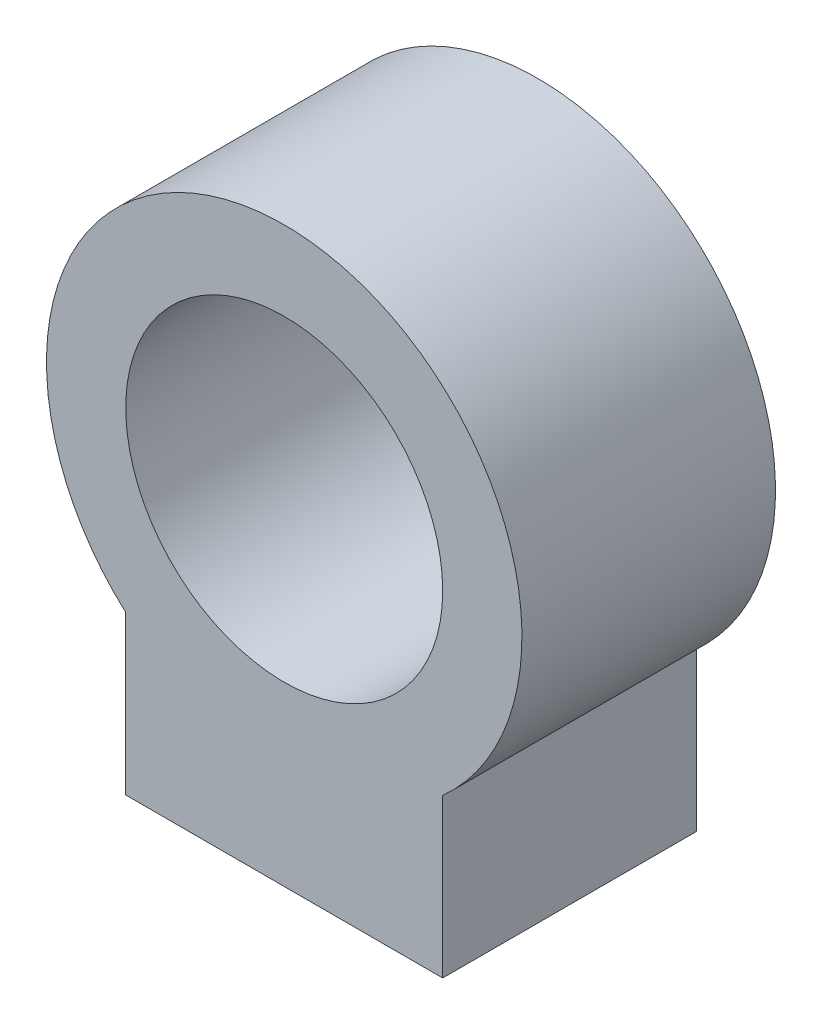
ISO-10303-21;
HEADER;
FILE_DESCRIPTION(('STEP AP214'),'2;1');
FILE_NAME('part.step','',(''),(''),'','','');
FILE_SCHEMA(('AUTOMOTIVE_DESIGN { 1 0 10303 214 1 1 1 1 }'));
ENDSEC;
DATA;
#1=APPLICATION_CONTEXT('core data for automotive mechanical design processes');
#2=APPLICATION_PROTOCOL_DEFINITION('international standard','automotive_design',2000,#1);
#3=PRODUCT_CONTEXT('',#1,'mechanical');
#4=PRODUCT('Part','Part','',(#3));
#5=PRODUCT_RELATED_PRODUCT_CATEGORY('part','',(#4));
#6=PRODUCT_DEFINITION_FORMATION('','',#4);
#7=PRODUCT_DEFINITION_CONTEXT('part definition',#1,'design');
#8=PRODUCT_DEFINITION('design','',#6,#7);
#9=PRODUCT_DEFINITION_SHAPE('','',#8);
#10=(LENGTH_UNIT() NAMED_UNIT(*) SI_UNIT(.MILLI.,.METRE.));
#11=(NAMED_UNIT(*) PLANE_ANGLE_UNIT() SI_UNIT($,.RADIAN.));
#12=(NAMED_UNIT(*) SI_UNIT($,.STERADIAN.) SOLID_ANGLE_UNIT());
#13=UNCERTAINTY_MEASURE_WITH_UNIT(LENGTH_MEASURE(1.E-05),#10,'distance_accuracy_value','');
#14=(GEOMETRIC_REPRESENTATION_CONTEXT(3) GLOBAL_UNCERTAINTY_ASSIGNED_CONTEXT((#13)) GLOBAL_UNIT_ASSIGNED_CONTEXT((#10,
#11,#12)) REPRESENTATION_CONTEXT('',''));
#15=CARTESIAN_POINT('',(0.,0.,0.));
#16=DIRECTION('',(0.,0.,1.));
#17=DIRECTION('',(1.,0.,0.));
#18=AXIS2_PLACEMENT_3D('',#15,#16,#17);
#19=CARTESIAN_POINT('',(25.,25.,-20.));
#20=DIRECTION('',(-1.,0.,0.));
#21=DIRECTION('',(0.,0.,1.));
#22=AXIS2_PLACEMENT_3D('',#19,#20,#21);
#23=PLANE('',#22);
#24=DIRECTION('',(0.,-1.,0.));
#25=VECTOR('',#24,1.);
#26=CARTESIAN_POINT('',(25.,25.,-20.));
#27=LINE('',#26,#25);
#28=CARTESIAN_POINT('',(25.,24.9491502812526,-20.));
#29=VERTEX_POINT('',#28);
#30=CARTESIAN_POINT('',(25.,0.,-20.));
#31=VERTEX_POINT('',#30);
#32=EDGE_CURVE('E11',#29,#31,#27,.T.);
#33=ORIENTED_EDGE('',*,*,#32,.F.);
#34=DIRECTION('',(0.,0.,1.));
#35=VECTOR('',#34,1.);
#36=CARTESIAN_POINT('',(25.,24.9491502812526,-20.));
#37=LINE('',#36,#35);
#38=CARTESIAN_POINT('',(25.,24.9491502812526,20.));
#39=VERTEX_POINT('',#38);
#40=EDGE_CURVE('E91',#29,#39,#37,.T.);
#41=ORIENTED_EDGE('',*,*,#40,.T.);
#42=DIRECTION('',(0.,-1.,0.));
#43=VECTOR('',#42,1.);
#44=CARTESIAN_POINT('',(25.,25.,20.));
#45=LINE('',#44,#43);
#46=CARTESIAN_POINT('',(25.,0.,20.));
#47=VERTEX_POINT('',#46);
#48=EDGE_CURVE('E89',#39,#47,#45,.T.);
#49=ORIENTED_EDGE('',*,*,#48,.T.);
#50=DIRECTION('',(0.,0.,-1.));
#51=VECTOR('',#50,1.);
#52=CARTESIAN_POINT('',(25.,0.,-20.));
#53=LINE('',#52,#51);
#54=EDGE_CURVE('E84',#47,#31,#53,.T.);
#55=ORIENTED_EDGE('',*,*,#54,.T.);
#56=EDGE_LOOP('',(#33,#41,#49,#55));
#57=FACE_BOUND('',#56,.T.);
#58=ADVANCED_FACE('F36',(#57),#23,.F.);
#59=CARTESIAN_POINT('',(-25.,25.,-20.));
#60=DIRECTION('',(0.,0.,1.));
#61=DIRECTION('',(1.,0.,0.));
#62=AXIS2_PLACEMENT_3D('',#59,#60,#61);
#63=PLANE('',#62);
#64=CARTESIAN_POINT('',(0.,52.9,-20.));
#65=DIRECTION('',(0.,0.,1.));
#66=DIRECTION('',(1.,0.,0.));
#67=AXIS2_PLACEMENT_3D('',#64,#65,#66);
#68=CIRCLE('',#67,25.);
#69=CARTESIAN_POINT('',(25.,52.9,-20.));
#70=VERTEX_POINT('',#69);
#71=EDGE_CURVE('E113',#70,#70,#68,.T.);
#72=ORIENTED_EDGE('',*,*,#71,.T.);
#73=EDGE_LOOP('',(#72));
#74=FACE_BOUND('',#73,.T.);
#75=CARTESIAN_POINT('',(0.,52.9,-20.));
#76=DIRECTION('',(0.,0.,1.));
#77=DIRECTION('',(1.,0.,0.));
#78=AXIS2_PLACEMENT_3D('',#75,#76,#77);
#79=CIRCLE('',#78,37.5);
#80=CARTESIAN_POINT('',(-25.,24.9491502812526,-20.));
#81=VERTEX_POINT('',#80);
#82=EDGE_CURVE('E79',#29,#81,#79,.T.);
#83=ORIENTED_EDGE('',*,*,#82,.F.);
#84=ORIENTED_EDGE('',*,*,#32,.T.);
#85=DIRECTION('',(-1.,0.,0.));
#86=VECTOR('',#85,1.);
#87=CARTESIAN_POINT('',(-25.,0.,-20.));
#88=LINE('',#87,#86);
#89=CARTESIAN_POINT('',(-25.,0.,-20.));
#90=VERTEX_POINT('',#89);
#91=EDGE_CURVE('E76',#31,#90,#88,.T.);
#92=ORIENTED_EDGE('',*,*,#91,.T.);
#93=DIRECTION('',(0.,-1.,0.));
#94=VECTOR('',#93,1.);
#95=CARTESIAN_POINT('',(-25.,25.,-20.));
#96=LINE('',#95,#94);
#97=EDGE_CURVE('E43',#81,#90,#96,.T.);
#98=ORIENTED_EDGE('',*,*,#97,.F.);
#99=EDGE_LOOP('',(#83,#84,#92,#98));
#100=FACE_BOUND('',#99,.T.);
#101=ADVANCED_FACE('F75',(#74,#100),#63,.F.);
#102=CARTESIAN_POINT('',(-25.,25.,-20.));
#103=DIRECTION('',(1.,0.,0.));
#104=DIRECTION('',(0.,0.,-1.));
#105=AXIS2_PLACEMENT_3D('',#102,#103,#104);
#106=PLANE('',#105);
#107=DIRECTION('',(0.,-1.,0.));
#108=VECTOR('',#107,1.);
#109=CARTESIAN_POINT('',(-25.,25.,20.));
#110=LINE('',#109,#108);
#111=CARTESIAN_POINT('',(-25.,24.9491502812526,20.));
#112=VERTEX_POINT('',#111);
#113=CARTESIAN_POINT('',(-25.,0.,20.));
#114=VERTEX_POINT('',#113);
#115=EDGE_CURVE('E100',#112,#114,#110,.T.);
#116=ORIENTED_EDGE('',*,*,#115,.F.);
#117=DIRECTION('',(0.,0.,1.));
#118=VECTOR('',#117,1.);
#119=CARTESIAN_POINT('',(-25.,24.9491502812526,-20.));
#120=LINE('',#119,#118);
#121=EDGE_CURVE('E56',#112,#81,#120,.F.);
#122=ORIENTED_EDGE('',*,*,#121,.T.);
#123=ORIENTED_EDGE('',*,*,#97,.T.);
#124=DIRECTION('',(0.,0.,1.));
#125=VECTOR('',#124,1.);
#126=CARTESIAN_POINT('',(-25.,0.,-20.));
#127=LINE('',#126,#125);
#128=EDGE_CURVE('E86',#90,#114,#127,.T.);
#129=ORIENTED_EDGE('',*,*,#128,.T.);
#130=EDGE_LOOP('',(#116,#122,#123,#129));
#131=FACE_BOUND('',#130,.T.);
#132=ADVANCED_FACE('F101',(#131),#106,.F.);
#133=CARTESIAN_POINT('',(-25.,25.,20.));
#134=DIRECTION('',(0.,0.,-1.));
#135=DIRECTION('',(-1.,0.,0.));
#136=AXIS2_PLACEMENT_3D('',#133,#134,#135);
#137=PLANE('',#136);
#138=CARTESIAN_POINT('',(0.,52.9,20.));
#139=DIRECTION('',(0.,0.,1.));
#140=DIRECTION('',(1.,0.,0.));
#141=AXIS2_PLACEMENT_3D('',#138,#139,#140);
#142=CIRCLE('',#141,25.);
#143=CARTESIAN_POINT('',(25.,52.9,20.));
#144=VERTEX_POINT('',#143);
#145=EDGE_CURVE('E108',#144,#144,#142,.T.);
#146=ORIENTED_EDGE('',*,*,#145,.F.);
#147=EDGE_LOOP('',(#146));
#148=FACE_BOUND('',#147,.T.);
#149=ORIENTED_EDGE('',*,*,#48,.F.);
#150=CARTESIAN_POINT('',(0.,52.9,20.));
#151=DIRECTION('',(0.,0.,1.));
#152=DIRECTION('',(1.,0.,0.));
#153=AXIS2_PLACEMENT_3D('',#150,#151,#152);
#154=CIRCLE('',#153,37.5);
#155=EDGE_CURVE('E106',#39,#112,#154,.T.);
#156=ORIENTED_EDGE('',*,*,#155,.T.);
#157=ORIENTED_EDGE('',*,*,#115,.T.);
#158=DIRECTION('',(1.,0.,0.));
#159=VECTOR('',#158,1.);
#160=CARTESIAN_POINT('',(-25.,0.,20.));
#161=LINE('',#160,#159);
#162=EDGE_CURVE('E97',#114,#47,#161,.T.);
#163=ORIENTED_EDGE('',*,*,#162,.T.);
#164=EDGE_LOOP('',(#149,#156,#157,#163));
#165=FACE_BOUND('',#164,.T.);
#166=ADVANCED_FACE('F133',(#148,#165),#137,.F.);
#167=CARTESIAN_POINT('',(0.,0.,0.));
#168=DIRECTION('',(0.,1.,0.));
#169=DIRECTION('',(0.,0.,1.));
#170=AXIS2_PLACEMENT_3D('',#167,#168,#169);
#171=PLANE('',#170);
#172=ORIENTED_EDGE('',*,*,#54,.F.);
#173=ORIENTED_EDGE('',*,*,#162,.F.);
#174=ORIENTED_EDGE('',*,*,#128,.F.);
#175=ORIENTED_EDGE('',*,*,#91,.F.);
#176=EDGE_LOOP('',(#172,#173,#174,#175));
#177=FACE_BOUND('',#176,.T.);
#178=ADVANCED_FACE('F82',(#177),#171,.F.);
#179=CARTESIAN_POINT('',(0.,52.9,-20.));
#180=DIRECTION('',(0.,0.,1.));
#181=DIRECTION('',(1.,0.,0.));
#182=AXIS2_PLACEMENT_3D('',#179,#180,#181);
#183=CYLINDRICAL_SURFACE('',#182,37.5);
#184=ORIENTED_EDGE('',*,*,#40,.F.);
#185=ORIENTED_EDGE('',*,*,#82,.T.);
#186=ORIENTED_EDGE('',*,*,#121,.F.);
#187=ORIENTED_EDGE('',*,*,#155,.F.);
#188=EDGE_LOOP('',(#184,#185,#186,#187));
#189=FACE_BOUND('',#188,.T.);
#190=ADVANCED_FACE('F103',(#189),#183,.T.);
#191=CARTESIAN_POINT('',(0.,52.9,20.));
#192=DIRECTION('',(0.,0.,-1.));
#193=DIRECTION('',(-1.,0.,0.));
#194=AXIS2_PLACEMENT_3D('',#191,#192,#193);
#195=CYLINDRICAL_SURFACE('',#194,25.);
#196=ORIENTED_EDGE('',*,*,#145,.T.);
#197=EDGE_LOOP('',(#196));
#198=FACE_BOUND('',#197,.T.);
#199=ORIENTED_EDGE('',*,*,#71,.F.);
#200=EDGE_LOOP('',(#199));
#201=FACE_BOUND('',#200,.T.);
#202=ADVANCED_FACE('F118',(#198,#201),#195,.F.);
#203=CLOSED_SHELL('',(#58,#101,#132,#166,#178,#190,#202));
#204=MANIFOLD_SOLID_BREP('B2',#203);
#205=ADVANCED_BREP_SHAPE_REPRESENTATION('',(#18,#204),#14);
#206=SHAPE_DEFINITION_REPRESENTATION(#9,#205);
ENDSEC;
END-ISO-10303-21;
